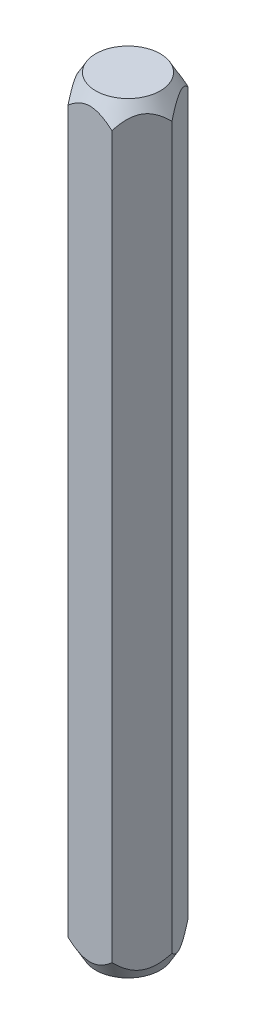
ISO-10303-21;
HEADER;
FILE_DESCRIPTION(('STEP AP214'),'2;1');
FILE_NAME('part.step','',(''),(''),'','','');
FILE_SCHEMA(('AUTOMOTIVE_DESIGN { 1 0 10303 214 1 1 1 1 }'));
ENDSEC;
DATA;
#1=APPLICATION_CONTEXT('core data for automotive mechanical design processes');
#2=APPLICATION_PROTOCOL_DEFINITION('international standard','automotive_design',2000,#1);
#3=PRODUCT_CONTEXT('',#1,'mechanical');
#4=PRODUCT('Part','Part','',(#3));
#5=PRODUCT_RELATED_PRODUCT_CATEGORY('part','',(#4));
#6=PRODUCT_DEFINITION_FORMATION('','',#4);
#7=PRODUCT_DEFINITION_CONTEXT('part definition',#1,'design');
#8=PRODUCT_DEFINITION('design','',#6,#7);
#9=PRODUCT_DEFINITION_SHAPE('','',#8);
#10=(LENGTH_UNIT() NAMED_UNIT(*) SI_UNIT(.MILLI.,.METRE.));
#11=(NAMED_UNIT(*) PLANE_ANGLE_UNIT() SI_UNIT($,.RADIAN.));
#12=(NAMED_UNIT(*) SI_UNIT($,.STERADIAN.) SOLID_ANGLE_UNIT());
#13=UNCERTAINTY_MEASURE_WITH_UNIT(LENGTH_MEASURE(1.E-05),#10,'distance_accuracy_value','');
#14=(GEOMETRIC_REPRESENTATION_CONTEXT(3) GLOBAL_UNCERTAINTY_ASSIGNED_CONTEXT((#13)) GLOBAL_UNIT_ASSIGNED_CONTEXT((#10,
#11,#12)) REPRESENTATION_CONTEXT('',''));
#15=CARTESIAN_POINT('',(0.,0.,0.));
#16=DIRECTION('',(0.,0.,1.));
#17=DIRECTION('',(1.,0.,0.));
#18=AXIS2_PLACEMENT_3D('',#15,#16,#17);
#19=CARTESIAN_POINT('',(0.,-13.,0.));
#20=DIRECTION('',(0.,1.,0.));
#21=DIRECTION('',(0.,0.,1.));
#22=AXIS2_PLACEMENT_3D('',#19,#20,#21);
#23=PLANE('',#22);
#24=CARTESIAN_POINT('',(0.,-13.,0.));
#25=DIRECTION('',(0.,-1.,0.));
#26=DIRECTION('',(0.,0.,-1.));
#27=AXIS2_PLACEMENT_3D('',#24,#25,#26);
#28=CIRCLE('',#27,1.1);
#29=CARTESIAN_POINT('',(0.,-13.,-1.1));
#30=VERTEX_POINT('',#29);
#31=EDGE_CURVE('E235',#30,#30,#28,.T.);
#32=ORIENTED_EDGE('',*,*,#31,.T.);
#33=EDGE_LOOP('',(#32));
#34=FACE_BOUND('',#33,.T.);
#35=ADVANCED_FACE('F41',(#34),#23,.F.);
#36=CARTESIAN_POINT('',(0.,-12.3,0.));
#37=DIRECTION('',(0.,1.,0.));
#38=DIRECTION('',(0.,0.,1.));
#39=AXIS2_PLACEMENT_3D('',#36,#37,#38);
#40=CONICAL_SURFACE('',#39,1.5,0.519146114246519);
#41=ORIENTED_EDGE('',*,*,#31,.F.);
#42=EDGE_LOOP('',(#41));
#43=FACE_BOUND('',#42,.T.);
#44=CARTESIAN_POINT('',(-2.07253485495861,-10.6445054642753,1.29903810567668));
#45=CARTESIAN_POINT('',(-2.03538623793564,-10.6995854387625,1.29903810567668));
#46=CARTESIAN_POINT('',(-1.99804778135316,-10.7545379106194,1.29903810567668));
#47=CARTESIAN_POINT('',(-1.92291943767532,-10.8641377250613,1.29903810567668));
#48=CARTESIAN_POINT('',(-1.88512952568828,-10.9187850505755,1.29903810567668));
#49=CARTESIAN_POINT('',(-1.77082429318832,-11.0824095365471,1.29903810567668));
#50=CARTESIAN_POINT('',(-1.69352606536808,-11.190841663383,1.29903810567667));
#51=CARTESIAN_POINT('',(-1.53196552591616,-11.4111605751849,1.29903810567667));
#52=CARTESIAN_POINT('',(-1.44754976557089,-11.5229362538769,1.29903810567667));
#53=CARTESIAN_POINT('',(-1.31736248949664,-11.687707759074,1.29903810567667));
#54=CARTESIAN_POINT('',(-1.2733938559672,-11.7421251999243,1.29903810567667));
#55=CARTESIAN_POINT('',(-1.18394248532172,-11.8496971859777,1.29903810567667));
#56=CARTESIAN_POINT('',(-1.13845992720302,-11.9028518792159,1.29903810567667));
#57=CARTESIAN_POINT('',(-1.04606630373218,-12.0068956974134,1.29903810567667));
#58=CARTESIAN_POINT('',(-0.99917589751005,-12.0578030562562,1.29903810567667));
#59=CARTESIAN_POINT('',(-0.902905518082981,-12.1573290918742,1.29903810567667));
#60=CARTESIAN_POINT('',(-0.853523188312257,-12.2059455148546,1.29903810567667));
#61=CARTESIAN_POINT('',(-0.752132260774152,-12.2992068812944,1.29903810567666));
#62=CARTESIAN_POINT('',(-0.700159699118788,-12.3438905358105,1.29903810567666));
#63=CARTESIAN_POINT('',(-0.592198590812927,-12.42803583742,1.29903810567666));
#64=CARTESIAN_POINT('',(-0.536218911719411,-12.4675084969099,1.29903810567666));
#65=CARTESIAN_POINT('',(-0.433498084070132,-12.5295405301596,1.29903810567666));
#66=CARTESIAN_POINT('',(-0.387849628266947,-12.5538748512374,1.29903810567666));
#67=CARTESIAN_POINT('',(-0.293526604004841,-12.5957302033474,1.29903810567666));
#68=CARTESIAN_POINT('',(-0.24485895800278,-12.613266197404,1.29903810567666));
#69=CARTESIAN_POINT('',(-0.15319315040133,-12.6370694717298,1.29903810567666));
#70=CARTESIAN_POINT('',(-0.110559843935735,-12.6447054155175,1.29903810567666));
#71=CARTESIAN_POINT('',(-0.0245950358367171,-12.6525133256309,1.29903810567666));
#72=CARTESIAN_POINT('',(0.0187362836021593,-12.6526872090989,1.29903810567666));
#73=CARTESIAN_POINT('',(0.1046758971115,-12.6455528412022,1.29903810567666));
#74=CARTESIAN_POINT('',(0.147285340581523,-12.6382579036111,1.29903810567666));
#75=CARTESIAN_POINT('',(0.230844394471177,-12.6172064684648,1.29903810567665));
#76=CARTESIAN_POINT('',(0.271792683893705,-12.6034449338227,1.29903810567665));
#77=CARTESIAN_POINT('',(0.379155683060805,-12.5596243102184,1.29903810567665));
#78=CARTESIAN_POINT('',(0.443632811839523,-12.524872986136,1.29903810567665));
#79=CARTESIAN_POINT('',(0.536093495284723,-12.4662230265959,1.29903810567665));
#80=CARTESIAN_POINT('',(0.566280834868057,-12.4455205799594,1.29903810567665));
#81=CARTESIAN_POINT('',(0.625395796048653,-12.4023888180353,1.29903810567665));
#82=CARTESIAN_POINT('',(0.65432387889121,-12.3799601435129,1.29903810567665));
#83=CARTESIAN_POINT('',(0.731646260557354,-12.3170177665695,1.29903810567665));
#84=CARTESIAN_POINT('',(0.778952826746299,-12.2751785470326,1.29903810567665));
#85=CARTESIAN_POINT('',(0.871034974400611,-12.1887832099594,1.29903810567665));
#86=CARTESIAN_POINT('',(0.915808803866981,-12.1442252549995,1.29903810567665));
#87=CARTESIAN_POINT('',(1.00345191718129,-12.0530954920219,1.29903810567665));
#88=CARTESIAN_POINT('',(1.0463167473225,-12.0065194285746,1.29903810567665));
#89=CARTESIAN_POINT('',(1.13045799987153,-11.9119490096584,1.29903810567665));
#90=CARTESIAN_POINT('',(1.17173414809036,-11.8639544118706,1.29903810567664));
#91=CARTESIAN_POINT('',(1.29402411346602,-11.7179577797709,1.29903810567664));
#92=CARTESIAN_POINT('',(1.37311876688961,-11.6183520364851,1.29903810567664));
#93=CARTESIAN_POINT('',(1.5277949862243,-11.4166840738683,1.29903810567664));
#94=CARTESIAN_POINT('',(1.6033807977517,-11.3146250626919,1.29903810567664));
#95=CARTESIAN_POINT('',(1.74551356738803,-11.1179594614914,1.29903810567664));
#96=CARTESIAN_POINT('',(1.81226533710321,-11.0235002712326,1.29903810567664));
#97=CARTESIAN_POINT('',(1.94369038410244,-10.8343046189558,1.29903810567664));
#98=CARTESIAN_POINT('',(2.00837631113089,-10.739576959479,1.29903810567664));
#99=CARTESIAN_POINT('',(2.07253485495865,-10.6445054642753,1.29903810567664));
#100=B_SPLINE_CURVE_WITH_KNOTS('',3,(#44,#45,#46,#47,#48,#49,#50,#51,#52,#53,#54,#55,#56,#57,
#58,#59,#60,#61,#62,#63,#64,#65,#66,#67,#68,#69,#70,#71,#72,#73,#74,#75,#76,#77,#78,#79,#80,#81,
#82,#83,#84,#85,#86,#87,#88,#89,#90,#91,#92,#93,#94,#95,#96,#97,#98,#99),.UNSPECIFIED.,.F.,.F.,
(4,2,2,2,2,2,2,2,2,2,2,2,2,2,2,2,2,2,2,2,2,2,2,2,2,2,2,4),(0.,0.199309941791665,
0.398630924034156,0.798094667911543,1.21820476163974,1.42806663426301,1.63790378160688,
1.84548111764697,2.05325857539453,2.25868516950042,2.46367043823923,2.6184799554092,
2.77294677782483,2.90229727841162,3.03161454624821,3.16070169633707,3.28988956459299,
3.5082750015484,3.61806680102762,3.7278180412222,3.91711654272995,4.10654442762103,
4.29639328838321,4.48627476936934,4.86771182519658,5.24867463357979,5.59565170158734,
5.93975000862927),.UNSPECIFIED.);
#101=CARTESIAN_POINT('',(-0.749999999999982,-12.3,1.29903810567666));
#102=VERTEX_POINT('',#101);
#103=CARTESIAN_POINT('',(0.750000000000015,-12.3,1.29903810567665));
#104=VERTEX_POINT('',#103);
#105=EDGE_CURVE('E226',#102,#104,#100,.T.);
#106=ORIENTED_EDGE('',*,*,#105,.F.);
#107=CARTESIAN_POINT('',(-1.50011427265704,-12.2998,-0.000197926047896112));
#108=CARTESIAN_POINT('',(-1.4844560329754,-12.3271747579679,0.0269229406377911));
#109=CARTESIAN_POINT('',(-1.46848195449817,-12.3538800893295,0.0545908561644544));
#110=CARTESIAN_POINT('',(-1.43569548405083,-12.4055169111973,0.111378688780088));
#111=CARTESIAN_POINT('',(-1.41887901814407,-12.4304380044114,0.140505662134349));
#112=CARTESIAN_POINT('',(-1.38391500160076,-12.4783836425917,0.201065115224034));
#113=CARTESIAN_POINT('',(-1.36574408969251,-12.5013411744891,0.232538057868983));
#114=CARTESIAN_POINT('',(-1.32841093508815,-12.5436117266531,0.297200978450572));
#115=CARTESIAN_POINT('',(-1.30925105807725,-12.5629329732754,0.330386858900213));
#116=CARTESIAN_POINT('',(-1.26838798330661,-12.5980525589006,0.401163780556447));
#117=CARTESIAN_POINT('',(-1.24660186054834,-12.6134770395848,0.438898452073694));
#118=CARTESIAN_POINT('',(-1.20221357157386,-12.6369483088712,0.515781223838552));
#119=CARTESIAN_POINT('',(-1.17961959829794,-12.6450547788082,0.554915133497294));
#120=CARTESIAN_POINT('',(-1.13384224962675,-12.6528895799723,0.634203827231584));
#121=CARTESIAN_POINT('',(-1.11065535633217,-12.6525397632328,0.674364704487475));
#122=CARTESIAN_POINT('',(-1.06467286203397,-12.6433215388631,0.75400872087071));
#123=CARTESIAN_POINT('',(-1.04187839232794,-12.6344317002164,0.793489900533146));
#124=CARTESIAN_POINT('',(-0.991146983129713,-12.6060006684914,0.881359278804033));
#125=CARTESIAN_POINT('',(-0.963537845666472,-12.5841886627298,0.929179707643519));
#126=CARTESIAN_POINT('',(-0.910253599849042,-12.5323504473517,1.0214707286423));
#127=CARTESIAN_POINT('',(-0.884588776237873,-12.5022839857869,1.06592350710413));
#128=CARTESIAN_POINT('',(-0.8403915127757,-12.443815750008,1.14247541297612));
#129=CARTESIAN_POINT('',(-0.82150955139978,-12.4164389030966,1.17517992942577));
#130=CARTESIAN_POINT('',(-0.784926482622611,-12.3595575952382,1.23854366324461));
#131=CARTESIAN_POINT('',(-0.767213792789508,-12.3300831132095,1.26922294197425));
#132=CARTESIAN_POINT('',(-0.749885727342731,-12.2997999999996,1.29923603172495));
#133=B_SPLINE_CURVE_WITH_KNOTS('',3,(#107,#108,#109,#110,#111,#112,#113,#114,#115,#116,#117,
#118,#119,#120,#121,#122,#123,#124,#125,#126,#127,#128,#129,#130,#131,#132),.UNSPECIFIED.,.F.,
.F.,(4,2,2,2,2,2,2,2,2,2,2,2,4),(0.,0.124825594013034,0.250327656131258,0.379126359053955,
0.50763008326451,0.645790755097726,0.7828142157728,0.921104445712331,1.05974262128001,
1.2368440400738,1.41482490290691,1.55465046692619,1.69277279754431),.UNSPECIFIED.);
#134=CARTESIAN_POINT('',(-1.5,-12.3,0.));
#135=VERTEX_POINT('',#134);
#136=EDGE_CURVE('E229',#135,#102,#133,.T.);
#137=ORIENTED_EDGE('',*,*,#136,.F.);
#138=CARTESIAN_POINT('',(-0.74988572734275,-12.2997999999996,-1.29923603172494));
#139=CARTESIAN_POINT('',(-0.765543967024386,-12.3271747579676,-1.27211516503925));
#140=CARTESIAN_POINT('',(-0.781518045501619,-12.3538800893291,-1.24444724951259));
#141=CARTESIAN_POINT('',(-0.814304515948947,-12.405516911197,-1.18765941689696));
#142=CARTESIAN_POINT('',(-0.831120981855707,-12.4304380044111,-1.15853244354271));
#143=CARTESIAN_POINT('',(-0.86608499839901,-12.4783836425914,-1.09797299045303));
#144=CARTESIAN_POINT('',(-0.884255910307259,-12.5013411744888,-1.06650004780808));
#145=CARTESIAN_POINT('',(-0.921589064911623,-12.5436117266528,-1.0018371272265));
#146=CARTESIAN_POINT('',(-0.940748941922516,-12.5629329732752,-0.968651246776858));
#147=CARTESIAN_POINT('',(-0.981612016693154,-12.5980525589004,-0.897874325120626));
#148=CARTESIAN_POINT('',(-1.00339813945142,-12.6134770395847,-0.860139653603378));
#149=CARTESIAN_POINT('',(-1.04778642842591,-12.6369483088711,-0.783256881838514));
#150=CARTESIAN_POINT('',(-1.07038040170183,-12.6450547788082,-0.744122972179767));
#151=CARTESIAN_POINT('',(-1.11615775037302,-12.6528895799723,-0.664834278445462));
#152=CARTESIAN_POINT('',(-1.13934464366761,-12.6525397632328,-0.62467340118956));
#153=CARTESIAN_POINT('',(-1.18532713796582,-12.6433215388632,-0.5450293848063));
#154=CARTESIAN_POINT('',(-1.20812160767186,-12.6344317002165,-0.505548205143849));
#155=CARTESIAN_POINT('',(-1.25885301687008,-12.6060006684915,-0.417678826872975));
#156=CARTESIAN_POINT('',(-1.2864621543333,-12.58418866273,-0.369858398033513));
#157=CARTESIAN_POINT('',(-1.33974640015071,-12.5323504473519,-0.277567377034778));
#158=CARTESIAN_POINT('',(-1.36541122376187,-12.5022839857872,-0.233114598572959));
#159=CARTESIAN_POINT('',(-1.40960848722404,-12.4438157500083,-0.156562692700972));
#160=CARTESIAN_POINT('',(-1.42849044859996,-12.4164389030969,-0.123858176251312));
#161=CARTESIAN_POINT('',(-1.46507351737715,-12.3595575952385,-0.0604944424324425));
#162=CARTESIAN_POINT('',(-1.48278620721026,-12.3300831132099,-0.0298151637027901));
#163=CARTESIAN_POINT('',(-1.50011427265704,-12.2998,0.000197926047917414));
#164=B_SPLINE_CURVE_WITH_KNOTS('',3,(#138,#139,#140,#141,#142,#143,#144,#145,#146,#147,#148,
#149,#150,#151,#152,#153,#154,#155,#156,#157,#158,#159,#160,#161,#162,#163),.UNSPECIFIED.,.F.,
.F.,(4,2,2,2,2,2,2,2,2,2,2,2,4),(0.,0.124825594013047,0.250327656131286,0.379126359054001,
0.507630083264572,0.645790755097818,0.782814215772923,0.921104445712489,1.05974262128021,
1.23684404007387,1.41482490290686,1.55465046692617,1.69277279754431),.UNSPECIFIED.);
#165=CARTESIAN_POINT('',(-0.750000000000009,-12.3,-1.29903810567665));
#166=VERTEX_POINT('',#165);
#167=EDGE_CURVE('E99',#166,#135,#164,.T.);
#168=ORIENTED_EDGE('',*,*,#167,.F.);
#169=CARTESIAN_POINT('',(2.07253485495862,-10.6445054642753,-1.29903810567666));
#170=CARTESIAN_POINT('',(2.03538623793565,-10.6995854387625,-1.29903810567666));
#171=CARTESIAN_POINT('',(1.99804778135317,-10.7545379106194,-1.29903810567666));
#172=CARTESIAN_POINT('',(1.92291943767533,-10.8641377250613,-1.29903810567666));
#173=CARTESIAN_POINT('',(1.88512952568829,-10.9187850505755,-1.29903810567666));
#174=CARTESIAN_POINT('',(1.77082429318833,-11.0824095365471,-1.29903810567666));
#175=CARTESIAN_POINT('',(1.69352606536809,-11.190841663383,-1.29903810567666));
#176=CARTESIAN_POINT('',(1.53196552591617,-11.4111605751849,-1.29903810567666));
#177=CARTESIAN_POINT('',(1.4475497655709,-11.5229362538769,-1.29903810567666));
#178=CARTESIAN_POINT('',(1.31736248949665,-11.687707759074,-1.29903810567666));
#179=CARTESIAN_POINT('',(1.27339385596721,-11.7421251999243,-1.29903810567666));
#180=CARTESIAN_POINT('',(1.18394248532173,-11.8496971859777,-1.29903810567666));
#181=CARTESIAN_POINT('',(1.13845992720303,-11.9028518792159,-1.29903810567666));
#182=CARTESIAN_POINT('',(1.04606630373219,-12.0068956974133,-1.29903810567666));
#183=CARTESIAN_POINT('',(0.99917589751006,-12.0578030562562,-1.29903810567666));
#184=CARTESIAN_POINT('',(0.902905518082992,-12.1573290918742,-1.29903810567666));
#185=CARTESIAN_POINT('',(0.853523188312268,-12.2059455148546,-1.29903810567666));
#186=CARTESIAN_POINT('',(0.752132260774163,-12.2992068812944,-1.29903810567666));
#187=CARTESIAN_POINT('',(0.700159699118799,-12.3438905358105,-1.29903810567666));
#188=CARTESIAN_POINT('',(0.592198590812938,-12.42803583742,-1.29903810567666));
#189=CARTESIAN_POINT('',(0.536218911719422,-12.4675084969099,-1.29903810567666));
#190=CARTESIAN_POINT('',(0.433498084070144,-12.5295405301596,-1.29903810567666));
#191=CARTESIAN_POINT('',(0.387849628266959,-12.5538748512374,-1.29903810567666));
#192=CARTESIAN_POINT('',(0.293526604004853,-12.5957302033474,-1.29903810567666));
#193=CARTESIAN_POINT('',(0.244858958002792,-12.613266197404,-1.29903810567666));
#194=CARTESIAN_POINT('',(0.153193150401342,-12.6370694717298,-1.29903810567666));
#195=CARTESIAN_POINT('',(0.110559843935746,-12.6447054155175,-1.29903810567666));
#196=CARTESIAN_POINT('',(0.0245950358367283,-12.6525133256309,-1.29903810567666));
#197=CARTESIAN_POINT('',(-0.0187362836021482,-12.6526872090989,-1.29903810567666));
#198=CARTESIAN_POINT('',(-0.104675897111488,-12.6455528412022,-1.29903810567666));
#199=CARTESIAN_POINT('',(-0.147285340581511,-12.6382579036111,-1.29903810567666));
#200=CARTESIAN_POINT('',(-0.230844394471166,-12.6172064684648,-1.29903810567666));
#201=CARTESIAN_POINT('',(-0.271792683893694,-12.6034449338227,-1.29903810567666));
#202=CARTESIAN_POINT('',(-0.379155683060794,-12.5596243102184,-1.29903810567666));
#203=CARTESIAN_POINT('',(-0.44363281183951,-12.524872986136,-1.29903810567666));
#204=CARTESIAN_POINT('',(-0.536093495284711,-12.4662230265959,-1.29903810567666));
#205=CARTESIAN_POINT('',(-0.566280834868045,-12.4455205799594,-1.29903810567666));
#206=CARTESIAN_POINT('',(-0.62539579604864,-12.4023888180353,-1.29903810567665));
#207=CARTESIAN_POINT('',(-0.654323878891197,-12.3799601435129,-1.29903810567665));
#208=CARTESIAN_POINT('',(-0.731646260557339,-12.3170177665695,-1.29903810567665));
#209=CARTESIAN_POINT('',(-0.778952826746284,-12.2751785470326,-1.29903810567665));
#210=CARTESIAN_POINT('',(-0.871034974400595,-12.1887832099594,-1.29903810567665));
#211=CARTESIAN_POINT('',(-0.915808803866964,-12.1442252549995,-1.29903810567665));
#212=CARTESIAN_POINT('',(-1.00345191718127,-12.0530954920219,-1.29903810567665));
#213=CARTESIAN_POINT('',(-1.04631674732248,-12.0065194285746,-1.29903810567665));
#214=CARTESIAN_POINT('',(-1.13045799987152,-11.9119490096584,-1.29903810567665));
#215=CARTESIAN_POINT('',(-1.17173414809034,-11.8639544118707,-1.29903810567665));
#216=CARTESIAN_POINT('',(-1.294024113466,-11.7179577797709,-1.29903810567665));
#217=CARTESIAN_POINT('',(-1.37311876688959,-11.6183520364851,-1.29903810567665));
#218=CARTESIAN_POINT('',(-1.52779498622428,-11.4166840738683,-1.29903810567665));
#219=CARTESIAN_POINT('',(-1.60338079775168,-11.3146250626919,-1.29903810567665));
#220=CARTESIAN_POINT('',(-1.745513567388,-11.1179594614914,-1.29903810567665));
#221=CARTESIAN_POINT('',(-1.81226533710318,-11.0235002712326,-1.29903810567665));
#222=CARTESIAN_POINT('',(-1.94369038410242,-10.8343046189558,-1.29903810567665));
#223=CARTESIAN_POINT('',(-2.00837631113086,-10.7395769594791,-1.29903810567665));
#224=CARTESIAN_POINT('',(-2.07253485495863,-10.6445054642753,-1.29903810567665));
#225=B_SPLINE_CURVE_WITH_KNOTS('',3,(#169,#170,#171,#172,#173,#174,#175,#176,#177,#178,#179,
#180,#181,#182,#183,#184,#185,#186,#187,#188,#189,#190,#191,#192,#193,#194,#195,#196,#197,#198,
#199,#200,#201,#202,#203,#204,#205,#206,#207,#208,#209,#210,#211,#212,#213,#214,#215,#216,#217,
#218,#219,#220,#221,#222,#223,#224),.UNSPECIFIED.,.F.,.F.,(4,2,2,2,2,2,2,2,2,2,2,2,2,2,2,2,2,2,
2,2,2,2,2,2,2,2,2,4),(0.,0.199309941791665,0.398630924034156,0.798094667911541,1.21820476163973,
1.42806663426301,1.63790378160687,1.84548111764697,2.05325857539452,2.25868516950042,
2.46367043823923,2.61847995540919,2.77294677782483,2.90229727841162,3.03161454624821,
3.16070169633707,3.28988956459298,3.5082750015484,3.61806680102762,3.72781804122219,
3.91711654272994,4.10654442762102,4.29639328838319,4.48627476936932,4.86771182519656,
5.24867463357977,5.59565170158731,5.93975000862924),.UNSPECIFIED.);
#226=CARTESIAN_POINT('',(0.749999999999991,-12.3,-1.29903810567666));
#227=VERTEX_POINT('',#226);
#228=EDGE_CURVE('E94',#227,#166,#225,.T.);
#229=ORIENTED_EDGE('',*,*,#228,.F.);
#230=CARTESIAN_POINT('',(1.50011427265704,-12.2998,0.00019792604790659));
#231=CARTESIAN_POINT('',(1.4844560329754,-12.3271747579679,-0.0269229406377801));
#232=CARTESIAN_POINT('',(1.46848195449817,-12.3538800893295,-0.0545908561644435));
#233=CARTESIAN_POINT('',(1.43569548405083,-12.4055169111973,-0.111378688780077));
#234=CARTESIAN_POINT('',(1.41887901814407,-12.4304380044114,-0.140505662134339));
#235=CARTESIAN_POINT('',(1.38391500160077,-12.4783836425917,-0.201065115224024));
#236=CARTESIAN_POINT('',(1.36574408969252,-12.5013411744891,-0.232538057868973));
#237=CARTESIAN_POINT('',(1.32841093508815,-12.5436117266531,-0.297200978450562));
#238=CARTESIAN_POINT('',(1.30925105807725,-12.5629329732754,-0.330386858900203));
#239=CARTESIAN_POINT('',(1.26838798330661,-12.5980525589006,-0.401163780556437));
#240=CARTESIAN_POINT('',(1.24660186054835,-12.6134770395848,-0.438898452073684));
#241=CARTESIAN_POINT('',(1.20221357157386,-12.6369483088712,-0.515781223838542));
#242=CARTESIAN_POINT('',(1.17961959829794,-12.6450547788082,-0.554915133497285));
#243=CARTESIAN_POINT('',(1.13384224962676,-12.6528895799723,-0.634203827231574));
#244=CARTESIAN_POINT('',(1.11065535633218,-12.6525397632328,-0.674364704487466));
#245=CARTESIAN_POINT('',(1.06467286203397,-12.6433215388631,-0.754008720870701));
#246=CARTESIAN_POINT('',(1.04187839232794,-12.6344317002164,-0.793489900533138));
#247=CARTESIAN_POINT('',(0.99114698312972,-12.6060006684914,-0.881359278804025));
#248=CARTESIAN_POINT('',(0.963537845666479,-12.5841886627298,-0.929179707643511));
#249=CARTESIAN_POINT('',(0.91025359984905,-12.5323504473517,-1.02147072864229));
#250=CARTESIAN_POINT('',(0.884588776237881,-12.5022839857869,-1.06592350710413));
#251=CARTESIAN_POINT('',(0.840391512775709,-12.443815750008,-1.14247541297612));
#252=CARTESIAN_POINT('',(0.821509551399789,-12.4164389030966,-1.17517992942576));
#253=CARTESIAN_POINT('',(0.78492648262262,-12.3595575952382,-1.23854366324461));
#254=CARTESIAN_POINT('',(0.767213792789518,-12.3300831132095,-1.26922294197425));
#255=CARTESIAN_POINT('',(0.74988572734274,-12.2997999999996,-1.29923603172494));
#256=B_SPLINE_CURVE_WITH_KNOTS('',3,(#230,#231,#232,#233,#234,#235,#236,#237,#238,#239,#240,
#241,#242,#243,#244,#245,#246,#247,#248,#249,#250,#251,#252,#253,#254,#255),.UNSPECIFIED.,.F.,
.F.,(4,2,2,2,2,2,2,2,2,2,2,2,4),(0.,0.124825594013033,0.250327656131256,0.379126359053955,
0.507630083264509,0.645790755097723,0.782814215772798,0.921104445712329,1.05974262128001,
1.2368440400738,1.41482490290691,1.55465046692619,1.69277279754431),.UNSPECIFIED.);
#257=CARTESIAN_POINT('',(1.5,-12.3,0.));
#258=VERTEX_POINT('',#257);
#259=EDGE_CURVE('E97',#258,#227,#256,.T.);
#260=ORIENTED_EDGE('',*,*,#259,.F.);
#261=CARTESIAN_POINT('',(0.749885727342759,-12.2997999999996,1.29923603172493));
#262=CARTESIAN_POINT('',(0.765543967024395,-12.3271747579676,1.27211516503925));
#263=CARTESIAN_POINT('',(0.781518045501628,-12.3538800893291,1.24444724951259));
#264=CARTESIAN_POINT('',(0.814304515948957,-12.405516911197,1.18765941689696));
#265=CARTESIAN_POINT('',(0.831120981855717,-12.4304380044111,1.1585324435427));
#266=CARTESIAN_POINT('',(0.86608499839902,-12.4783836425914,1.09797299045302));
#267=CARTESIAN_POINT('',(0.884255910307269,-12.5013411744888,1.06650004780807));
#268=CARTESIAN_POINT('',(0.921589064911633,-12.5436117266528,1.00183712722649));
#269=CARTESIAN_POINT('',(0.940748941922527,-12.5629329732752,0.96865124677685));
#270=CARTESIAN_POINT('',(0.981612016693165,-12.5980525589004,0.897874325120618));
#271=CARTESIAN_POINT('',(1.00339813945143,-12.6134770395847,0.86013965360337));
#272=CARTESIAN_POINT('',(1.04778642842592,-12.6369483088711,0.783256881838506));
#273=CARTESIAN_POINT('',(1.07038040170184,-12.6450547788081,0.744122972179758));
#274=CARTESIAN_POINT('',(1.11615775037303,-12.6528895799723,0.664834278445453));
#275=CARTESIAN_POINT('',(1.13934464366762,-12.6525397632328,0.624673401189551));
#276=CARTESIAN_POINT('',(1.18532713796584,-12.6433215388632,0.545029384806291));
#277=CARTESIAN_POINT('',(1.20812160767188,-12.6344317002165,0.505548205143841));
#278=CARTESIAN_POINT('',(1.25885301687009,-12.6060006684915,0.417678826872966));
#279=CARTESIAN_POINT('',(1.28646215433332,-12.58418866273,0.369858398033503));
#280=CARTESIAN_POINT('',(1.33974640015072,-12.5323504473519,0.277567377034766));
#281=CARTESIAN_POINT('',(1.36541122376188,-12.5022839857872,0.233114598572947));
#282=CARTESIAN_POINT('',(1.40960848722405,-12.4438157500083,0.156562692700963));
#283=CARTESIAN_POINT('',(1.42849044859997,-12.4164389030969,0.123858176251307));
#284=CARTESIAN_POINT('',(1.46507351737715,-12.3595575952385,0.0604944424324461));
#285=CARTESIAN_POINT('',(1.48278620721026,-12.3300831132099,0.0298151637027971));
#286=CARTESIAN_POINT('',(1.50011427265704,-12.2998,-0.000197926047906983));
#287=B_SPLINE_CURVE_WITH_KNOTS('',3,(#261,#262,#263,#264,#265,#266,#267,#268,#269,#270,#271,
#272,#273,#274,#275,#276,#277,#278,#279,#280,#281,#282,#283,#284,#285,#286),.UNSPECIFIED.,.F.,
.F.,(4,2,2,2,2,2,2,2,2,2,2,2,4),(0.,0.124825594013048,0.250327656131286,0.379126359054001,
0.507630083264573,0.645790755097819,0.782814215772924,0.92110444571249,1.05974262128021,
1.23684404007388,1.41482490290687,1.55465046692616,1.69277279754429),.UNSPECIFIED.);
#288=EDGE_CURVE('E66',#104,#258,#287,.T.);
#289=ORIENTED_EDGE('',*,*,#288,.F.);
#290=EDGE_LOOP('',(#106,#137,#168,#229,#260,#289));
#291=FACE_BOUND('',#290,.T.);
#292=ADVANCED_FACE('F96',(#43,#291),#40,.T.);
#293=CARTESIAN_POINT('',(0.750000000000015,13.,1.29903810567665));
#294=DIRECTION('',(-0.866025403784442,0.,-0.499999999999995));
#295=DIRECTION('',(-0.499999999999995,0.,0.866025403784442));
#296=AXIS2_PLACEMENT_3D('',#293,#294,#295);
#297=PLANE('',#296);
#298=DIRECTION('',(0.,-1.,0.));
#299=VECTOR('',#298,1.);
#300=CARTESIAN_POINT('',(1.5,13.,0.));
#301=LINE('',#300,#299);
#302=CARTESIAN_POINT('',(1.5,12.3,0.));
#303=VERTEX_POINT('',#302);
#304=EDGE_CURVE('E11',#303,#258,#301,.T.);
#305=ORIENTED_EDGE('',*,*,#304,.F.);
#306=CARTESIAN_POINT('',(1.50011427265704,12.2998,-0.000197926047911828));
#307=CARTESIAN_POINT('',(1.4844560329754,12.327174757968,0.0269229406377757));
#308=CARTESIAN_POINT('',(1.46848195449817,12.3538800893295,0.0545908561644392));
#309=CARTESIAN_POINT('',(1.43569548405084,12.4055169111973,0.111378688780073));
#310=CARTESIAN_POINT('',(1.41887901814408,12.4304380044114,0.140505662134334));
#311=CARTESIAN_POINT('',(1.38391500160077,12.4783836425917,0.20106511522402));
#312=CARTESIAN_POINT('',(1.36574408969252,12.5013411744891,0.232538057868969));
#313=CARTESIAN_POINT('',(1.32841093508815,12.543611726653,0.297200978450559));
#314=CARTESIAN_POINT('',(1.30925105807726,12.5629329732754,0.330386858900201));
#315=CARTESIAN_POINT('',(1.26838798330662,12.5980525589006,0.401163780556436));
#316=CARTESIAN_POINT('',(1.24660186054835,12.6134770395848,0.438898452073684));
#317=CARTESIAN_POINT('',(1.20221357157387,12.6369483088712,0.515781223838544));
#318=CARTESIAN_POINT('',(1.17961959829795,12.6450547788082,0.554915133497287));
#319=CARTESIAN_POINT('',(1.13384224962676,12.6528895799723,0.634203827231578));
#320=CARTESIAN_POINT('',(1.11065535633218,12.6525397632328,0.67436470448747));
#321=CARTESIAN_POINT('',(1.06467286203398,12.6433215388631,0.754008720870706));
#322=CARTESIAN_POINT('',(1.04187839232795,12.6344317002164,0.793489900533143));
#323=CARTESIAN_POINT('',(0.991146983129724,12.6060006684914,0.881359278804032));
#324=CARTESIAN_POINT('',(0.963537845666483,12.5841886627298,0.92917970764352));
#325=CARTESIAN_POINT('',(0.910253599849052,12.5323504473517,1.0214707286423));
#326=CARTESIAN_POINT('',(0.884588776237883,12.5022839857869,1.06592350710414));
#327=CARTESIAN_POINT('',(0.840391512775713,12.443815750008,1.14247541297613));
#328=CARTESIAN_POINT('',(0.821509551399796,12.4164389030966,1.17517992942577));
#329=CARTESIAN_POINT('',(0.784926482622631,12.3595575952382,1.23854366324461));
#330=CARTESIAN_POINT('',(0.767213792789531,12.3300831132095,1.26922294197424));
#331=CARTESIAN_POINT('',(0.749885727342755,12.2997999999996,1.29923603172494));
#332=B_SPLINE_CURVE_WITH_KNOTS('',3,(#306,#307,#308,#309,#310,#311,#312,#313,#314,#315,#316,
#317,#318,#319,#320,#321,#322,#323,#324,#325,#326,#327,#328,#329,#330,#331),.UNSPECIFIED.,.F.,
.F.,(4,2,2,2,2,2,2,2,2,2,2,2,4),(0.,0.124825594013033,0.250327656131255,0.379126359053952,
0.507630083264509,0.645790755097725,0.782814215772801,0.921104445712334,1.05974262128002,
1.23684404007381,1.41482490290692,1.55465046692619,1.6927727975443),.UNSPECIFIED.);
#333=CARTESIAN_POINT('',(0.750000000000015,12.3,1.29903810567665));
#334=VERTEX_POINT('',#333);
#335=EDGE_CURVE('E133',#303,#334,#332,.T.);
#336=ORIENTED_EDGE('',*,*,#335,.T.);
#337=DIRECTION('',(0.,-1.,0.));
#338=VECTOR('',#337,1.);
#339=CARTESIAN_POINT('',(0.750000000000015,13.,1.29903810567665));
#340=LINE('',#339,#338);
#341=EDGE_CURVE('E129',#334,#104,#340,.T.);
#342=ORIENTED_EDGE('',*,*,#341,.T.);
#343=ORIENTED_EDGE('',*,*,#288,.T.);
#344=EDGE_LOOP('',(#305,#336,#342,#343));
#345=FACE_BOUND('',#344,.T.);
#346=ADVANCED_FACE('F43',(#345),#297,.F.);
#347=CARTESIAN_POINT('',(1.5,13.,0.));
#348=DIRECTION('',(-0.866025403784438,0.,0.500000000000001));
#349=DIRECTION('',(0.500000000000001,0.,0.866025403784438));
#350=AXIS2_PLACEMENT_3D('',#347,#348,#349);
#351=PLANE('',#350);
#352=DIRECTION('',(0.,-1.,0.));
#353=VECTOR('',#352,1.);
#354=CARTESIAN_POINT('',(0.749999999999997,13.,-1.29903810567666));
#355=LINE('',#354,#353);
#356=CARTESIAN_POINT('',(0.749999999999997,12.3,-1.29903810567666));
#357=VERTEX_POINT('',#356);
#358=EDGE_CURVE('E51',#357,#227,#355,.T.);
#359=ORIENTED_EDGE('',*,*,#358,.F.);
#360=CARTESIAN_POINT('',(0.749885727342738,12.2997999999996,-1.29923603172495));
#361=CARTESIAN_POINT('',(0.765543967024374,12.3271747579676,-1.27211516503926));
#362=CARTESIAN_POINT('',(0.781518045501608,12.3538800893291,-1.2444472495126));
#363=CARTESIAN_POINT('',(0.814304515948936,12.405516911197,-1.18765941689697));
#364=CARTESIAN_POINT('',(0.831120981855697,12.4304380044111,-1.15853244354272));
#365=CARTESIAN_POINT('',(0.866084998399,12.4783836425914,-1.09797299045304));
#366=CARTESIAN_POINT('',(0.884255910307249,12.5013411744888,-1.06650004780809));
#367=CARTESIAN_POINT('',(0.921589064911613,12.5436117266528,-1.00183712722651));
#368=CARTESIAN_POINT('',(0.940748941922506,12.5629329732752,-0.96865124677687));
#369=CARTESIAN_POINT('',(0.981612016693145,12.5980525589004,-0.897874325120638));
#370=CARTESIAN_POINT('',(1.00339813945141,12.6134770395847,-0.86013965360339));
#371=CARTESIAN_POINT('',(1.0477864284259,12.6369483088711,-0.783256881838525));
#372=CARTESIAN_POINT('',(1.07038040170182,12.6450547788082,-0.744122972179778));
#373=CARTESIAN_POINT('',(1.11615775037302,12.6528895799723,-0.664834278445472));
#374=CARTESIAN_POINT('',(1.1393446436676,12.6525397632328,-0.62467340118957));
#375=CARTESIAN_POINT('',(1.18532713796582,12.6433215388632,-0.545029384806309));
#376=CARTESIAN_POINT('',(1.20812160767186,12.6344317002165,-0.505548205143858));
#377=CARTESIAN_POINT('',(1.25885301687008,12.6060006684915,-0.417678826872983));
#378=CARTESIAN_POINT('',(1.2864621543333,12.58418866273,-0.369858398033521));
#379=CARTESIAN_POINT('',(1.33974640015071,12.5323504473519,-0.277567377034785));
#380=CARTESIAN_POINT('',(1.36541122376187,12.5022839857872,-0.233114598572966));
#381=CARTESIAN_POINT('',(1.40960848722404,12.4438157500083,-0.156562692700978));
#382=CARTESIAN_POINT('',(1.42849044859997,12.4164389030969,-0.123858176251318));
#383=CARTESIAN_POINT('',(1.46507351737715,12.3595575952385,-0.0604944424324483));
#384=CARTESIAN_POINT('',(1.48278620721026,12.3300831132099,-0.0298151637027955));
#385=CARTESIAN_POINT('',(1.50011427265704,12.2998,0.000197926047912088));
#386=B_SPLINE_CURVE_WITH_KNOTS('',3,(#360,#361,#362,#363,#364,#365,#366,#367,#368,#369,#370,
#371,#372,#373,#374,#375,#376,#377,#378,#379,#380,#381,#382,#383,#384,#385),.UNSPECIFIED.,.F.,
.F.,(4,2,2,2,2,2,2,2,2,2,2,2,4),(0.,0.124825594013048,0.250327656131286,0.379126359054001,
0.507630083264572,0.645790755097819,0.782814215772926,0.921104445712494,1.05974262128021,
1.23684404007388,1.41482490290687,1.55465046692618,1.69277279754432),.UNSPECIFIED.);
#387=EDGE_CURVE('E142',#357,#303,#386,.T.);
#388=ORIENTED_EDGE('',*,*,#387,.T.);
#389=ORIENTED_EDGE('',*,*,#304,.T.);
#390=ORIENTED_EDGE('',*,*,#259,.T.);
#391=EDGE_LOOP('',(#359,#388,#389,#390));
#392=FACE_BOUND('',#391,.T.);
#393=ADVANCED_FACE('F108',(#392),#351,.F.);
#394=CARTESIAN_POINT('',(0.749999999999997,13.,-1.29903810567666));
#395=DIRECTION('',(0.,0.,1.));
#396=DIRECTION('',(1.,0.,0.));
#397=AXIS2_PLACEMENT_3D('',#394,#395,#396);
#398=PLANE('',#397);
#399=DIRECTION('',(0.,-1.,0.));
#400=VECTOR('',#399,1.);
#401=CARTESIAN_POINT('',(-0.750000000000006,13.,-1.29903810567665));
#402=LINE('',#401,#400);
#403=CARTESIAN_POINT('',(-0.750000000000006,12.3,-1.29903810567665));
#404=VERTEX_POINT('',#403);
#405=EDGE_CURVE('E117',#404,#166,#402,.T.);
#406=ORIENTED_EDGE('',*,*,#405,.F.);
#407=CARTESIAN_POINT('',(-2.07253485495864,10.6445054642753,-1.29903810567665));
#408=CARTESIAN_POINT('',(-2.03538623793567,10.6995854387625,-1.29903810567665));
#409=CARTESIAN_POINT('',(-1.99804778135319,10.7545379106194,-1.29903810567665));
#410=CARTESIAN_POINT('',(-1.92291943767536,10.8641377250613,-1.29903810567665));
#411=CARTESIAN_POINT('',(-1.88512952568831,10.9187850505755,-1.29903810567665));
#412=CARTESIAN_POINT('',(-1.77082429318835,11.0824095365471,-1.29903810567665));
#413=CARTESIAN_POINT('',(-1.69352606536811,11.190841663383,-1.29903810567665));
#414=CARTESIAN_POINT('',(-1.53196552591619,11.4111605751849,-1.29903810567665));
#415=CARTESIAN_POINT('',(-1.44754976557092,11.5229362538769,-1.29903810567665));
#416=CARTESIAN_POINT('',(-1.31736248949667,11.687707759074,-1.29903810567665));
#417=CARTESIAN_POINT('',(-1.27339385596723,11.7421251999243,-1.29903810567665));
#418=CARTESIAN_POINT('',(-1.18394248532174,11.8496971859777,-1.29903810567665));
#419=CARTESIAN_POINT('',(-1.13845992720305,11.9028518792159,-1.29903810567665));
#420=CARTESIAN_POINT('',(-1.04606630373221,12.0068956974134,-1.29903810567665));
#421=CARTESIAN_POINT('',(-0.999175897510075,12.0578030562562,-1.29903810567665));
#422=CARTESIAN_POINT('',(-0.902905518083006,12.1573290918742,-1.29903810567665));
#423=CARTESIAN_POINT('',(-0.853523188312282,12.2059455148546,-1.29903810567665));
#424=CARTESIAN_POINT('',(-0.752132260774176,12.2992068812944,-1.29903810567665));
#425=CARTESIAN_POINT('',(-0.700159699118812,12.3438905358105,-1.29903810567665));
#426=CARTESIAN_POINT('',(-0.59219859081295,12.42803583742,-1.29903810567666));
#427=CARTESIAN_POINT('',(-0.536218911719434,12.4675084969099,-1.29903810567666));
#428=CARTESIAN_POINT('',(-0.433498084070155,12.5295405301596,-1.29903810567666));
#429=CARTESIAN_POINT('',(-0.387849628266969,12.5538748512374,-1.29903810567666));
#430=CARTESIAN_POINT('',(-0.293526604004863,12.5957302033474,-1.29903810567666));
#431=CARTESIAN_POINT('',(-0.244858958002801,12.613266197404,-1.29903810567666));
#432=CARTESIAN_POINT('',(-0.153193150401351,12.6370694717298,-1.29903810567666));
#433=CARTESIAN_POINT('',(-0.110559843935755,12.6447054155175,-1.29903810567666));
#434=CARTESIAN_POINT('',(-0.0245950358367356,12.6525133256309,-1.29903810567666));
#435=CARTESIAN_POINT('',(0.0187362836021412,12.6526872090989,-1.29903810567666));
#436=CARTESIAN_POINT('',(0.104675897111483,12.6455528412023,-1.29903810567666));
#437=CARTESIAN_POINT('',(0.147285340581506,12.6382579036111,-1.29903810567666));
#438=CARTESIAN_POINT('',(0.230844394471162,12.6172064684648,-1.29903810567666));
#439=CARTESIAN_POINT('',(0.27179268389369,12.6034449338227,-1.29903810567666));
#440=CARTESIAN_POINT('',(0.379155683060791,12.5596243102184,-1.29903810567666));
#441=CARTESIAN_POINT('',(0.443632811839508,12.524872986136,-1.29903810567666));
#442=CARTESIAN_POINT('',(0.53609349528471,12.4662230265959,-1.29903810567666));
#443=CARTESIAN_POINT('',(0.566280834868045,12.4455205799594,-1.29903810567666));
#444=CARTESIAN_POINT('',(0.625395796048641,12.4023888180353,-1.29903810567666));
#445=CARTESIAN_POINT('',(0.654323878891199,12.3799601435129,-1.29903810567666));
#446=CARTESIAN_POINT('',(0.731646260557343,12.3170177665695,-1.29903810567666));
#447=CARTESIAN_POINT('',(0.778952826746289,12.2751785470326,-1.29903810567666));
#448=CARTESIAN_POINT('',(0.871034974400602,12.1887832099594,-1.29903810567666));
#449=CARTESIAN_POINT('',(0.915808803866973,12.1442252549995,-1.29903810567666));
#450=CARTESIAN_POINT('',(1.00345191718128,12.0530954920219,-1.29903810567666));
#451=CARTESIAN_POINT('',(1.0463167473225,12.0065194285746,-1.29903810567666));
#452=CARTESIAN_POINT('',(1.13045799987153,11.9119490096584,-1.29903810567666));
#453=CARTESIAN_POINT('',(1.17173414809036,11.8639544118706,-1.29903810567666));
#454=CARTESIAN_POINT('',(1.29402411346601,11.7179577797709,-1.29903810567666));
#455=CARTESIAN_POINT('',(1.37311876688961,11.6183520364851,-1.29903810567666));
#456=CARTESIAN_POINT('',(1.5277949862243,11.4166840738682,-1.29903810567666));
#457=CARTESIAN_POINT('',(1.60338079775171,11.3146250626918,-1.29903810567666));
#458=CARTESIAN_POINT('',(1.74551356738803,11.1179594614914,-1.29903810567666));
#459=CARTESIAN_POINT('',(1.8122653371032,11.0235002712326,-1.29903810567666));
#460=CARTESIAN_POINT('',(1.94369038410243,10.8343046189558,-1.29903810567666));
#461=CARTESIAN_POINT('',(2.00837631113087,10.7395769594791,-1.29903810567666));
#462=CARTESIAN_POINT('',(2.07253485495863,10.6445054642753,-1.29903810567666));
#463=B_SPLINE_CURVE_WITH_KNOTS('',3,(#407,#408,#409,#410,#411,#412,#413,#414,#415,#416,#417,
#418,#419,#420,#421,#422,#423,#424,#425,#426,#427,#428,#429,#430,#431,#432,#433,#434,#435,#436,
#437,#438,#439,#440,#441,#442,#443,#444,#445,#446,#447,#448,#449,#450,#451,#452,#453,#454,#455,
#456,#457,#458,#459,#460,#461,#462),.UNSPECIFIED.,.F.,.F.,(4,2,2,2,2,2,2,2,2,2,2,2,2,2,2,2,2,2,
2,2,2,2,2,2,2,2,2,4),(0.,0.199309941791665,0.398630924034157,0.798094667911543,1.21820476163973,
1.42806663426301,1.63790378160688,1.84548111764697,2.05325857539453,2.25868516950043,
2.46367043823924,2.6184799554092,2.77294677782484,2.90229727841163,3.03161454624822,
3.16070169633708,3.289889564593,3.50827500154842,3.61806680102764,3.72781804122221,
3.91711654272997,4.10654442762105,4.29639328838323,4.48627476936937,4.86771182519662,
5.24867463357984,5.59565170158735,5.93975000862926),.UNSPECIFIED.);
#464=EDGE_CURVE('E115',#404,#357,#463,.T.);
#465=ORIENTED_EDGE('',*,*,#464,.T.);
#466=ORIENTED_EDGE('',*,*,#358,.T.);
#467=ORIENTED_EDGE('',*,*,#228,.T.);
#468=EDGE_LOOP('',(#406,#465,#466,#467));
#469=FACE_BOUND('',#468,.T.);
#470=ADVANCED_FACE('F114',(#469),#398,.F.);
#471=CARTESIAN_POINT('',(-0.750000000000006,13.,-1.29903810567665));
#472=DIRECTION('',(0.866025403784442,0.,0.499999999999995));
#473=DIRECTION('',(0.499999999999995,0.,-0.866025403784442));
#474=AXIS2_PLACEMENT_3D('',#471,#472,#473);
#475=PLANE('',#474);
#476=DIRECTION('',(0.,-1.,0.));
#477=VECTOR('',#476,1.);
#478=CARTESIAN_POINT('',(-1.5,13.,0.));
#479=LINE('',#478,#477);
#480=CARTESIAN_POINT('',(-1.5,12.3,0.));
#481=VERTEX_POINT('',#480);
#482=EDGE_CURVE('E119',#481,#135,#479,.T.);
#483=ORIENTED_EDGE('',*,*,#482,.F.);
#484=CARTESIAN_POINT('',(-1.50011427265704,12.2998,0.000197926047922356));
#485=CARTESIAN_POINT('',(-1.4844560329754,12.327174757968,-0.0269229406377645));
#486=CARTESIAN_POINT('',(-1.46848195449817,12.3538800893295,-0.0545908561644278));
#487=CARTESIAN_POINT('',(-1.43569548405084,12.4055169111973,-0.111378688780062));
#488=CARTESIAN_POINT('',(-1.41887901814408,12.4304380044114,-0.140505662134323));
#489=CARTESIAN_POINT('',(-1.38391500160077,12.4783836425917,-0.201065115224009));
#490=CARTESIAN_POINT('',(-1.36574408969252,12.5013411744891,-0.232538057868958));
#491=CARTESIAN_POINT('',(-1.32841093508815,12.5436117266531,-0.297200978450548));
#492=CARTESIAN_POINT('',(-1.30925105807726,12.5629329732754,-0.33038685890019));
#493=CARTESIAN_POINT('',(-1.26838798330662,12.5980525589006,-0.401163780556424));
#494=CARTESIAN_POINT('',(-1.24660186054835,12.6134770395848,-0.438898452073672));
#495=CARTESIAN_POINT('',(-1.20221357157387,12.6369483088712,-0.515781223838531));
#496=CARTESIAN_POINT('',(-1.17961959829795,12.6450547788082,-0.554915133497275));
#497=CARTESIAN_POINT('',(-1.13384224962676,12.6528895799723,-0.634203827231566));
#498=CARTESIAN_POINT('',(-1.11065535633218,12.6525397632328,-0.674364704487458));
#499=CARTESIAN_POINT('',(-1.06467286203398,12.6433215388631,-0.754008720870694));
#500=CARTESIAN_POINT('',(-1.04187839232795,12.6344317002164,-0.793489900533132));
#501=CARTESIAN_POINT('',(-0.991146983129725,12.6060006684914,-0.88135927880402));
#502=CARTESIAN_POINT('',(-0.963537845666484,12.5841886627298,-0.929179707643507));
#503=CARTESIAN_POINT('',(-0.910253599849055,12.5323504473517,-1.02147072864229));
#504=CARTESIAN_POINT('',(-0.884588776237886,12.5022839857869,-1.06592350710412));
#505=CARTESIAN_POINT('',(-0.840391512775714,12.443815750008,-1.14247541297611));
#506=CARTESIAN_POINT('',(-0.821509551399794,12.4164389030966,-1.17517992942576));
#507=CARTESIAN_POINT('',(-0.784926482622625,12.3595575952382,-1.23854366324461));
#508=CARTESIAN_POINT('',(-0.767213792789523,12.3300831132095,-1.26922294197425));
#509=CARTESIAN_POINT('',(-0.749885727342746,12.2997999999996,-1.29923603172494));
#510=B_SPLINE_CURVE_WITH_KNOTS('',3,(#484,#485,#486,#487,#488,#489,#490,#491,#492,#493,#494,
#495,#496,#497,#498,#499,#500,#501,#502,#503,#504,#505,#506,#507,#508,#509),.UNSPECIFIED.,.F.,
.F.,(4,2,2,2,2,2,2,2,2,2,2,2,4),(0.,0.124825594013032,0.250327656131256,0.379126359053955,
0.50763008326451,0.645790755097727,0.782814215772803,0.921104445712336,1.05974262128002,
1.23684404007381,1.41482490290692,1.5546504669262,1.69277279754433),.UNSPECIFIED.);
#511=EDGE_CURVE('E177',#481,#404,#510,.T.);
#512=ORIENTED_EDGE('',*,*,#511,.T.);
#513=ORIENTED_EDGE('',*,*,#405,.T.);
#514=ORIENTED_EDGE('',*,*,#167,.T.);
#515=EDGE_LOOP('',(#483,#512,#513,#514));
#516=FACE_BOUND('',#515,.T.);
#517=ADVANCED_FACE('F191',(#516),#475,.F.);
#518=CARTESIAN_POINT('',(-1.5,13.,0.));
#519=DIRECTION('',(0.866025403784434,0.,-0.500000000000007));
#520=DIRECTION('',(-0.500000000000007,0.,-0.866025403784435));
#521=AXIS2_PLACEMENT_3D('',#518,#519,#520);
#522=PLANE('',#521);
#523=DIRECTION('',(0.,-1.,0.));
#524=VECTOR('',#523,1.);
#525=CARTESIAN_POINT('',(-0.749999999999988,13.,1.29903810567666));
#526=LINE('',#525,#524);
#527=CARTESIAN_POINT('',(-0.749999999999988,12.3,1.29903810567666));
#528=VERTEX_POINT('',#527);
#529=EDGE_CURVE('E125',#528,#102,#526,.T.);
#530=ORIENTED_EDGE('',*,*,#529,.F.);
#531=CARTESIAN_POINT('',(-0.749885727342728,12.2997999999996,1.29923603172495));
#532=CARTESIAN_POINT('',(-0.765543967024365,12.3271747579676,1.27211516503927));
#533=CARTESIAN_POINT('',(-0.781518045501599,12.3538800893291,1.24444724951261));
#534=CARTESIAN_POINT('',(-0.814304515948927,12.405516911197,1.18765941689698));
#535=CARTESIAN_POINT('',(-0.831120981855688,12.4304380044111,1.15853244354272));
#536=CARTESIAN_POINT('',(-0.866084998398991,12.4783836425914,1.09797299045304));
#537=CARTESIAN_POINT('',(-0.884255910307241,12.5013411744888,1.0665000478081));
#538=CARTESIAN_POINT('',(-0.921589064911606,12.5436117266528,1.00183712722651));
#539=CARTESIAN_POINT('',(-0.940748941922499,12.5629329732752,0.968651246776877));
#540=CARTESIAN_POINT('',(-0.981612016693138,12.5980525589004,0.897874325120645));
#541=CARTESIAN_POINT('',(-1.0033981394514,12.6134770395847,0.860139653603397));
#542=CARTESIAN_POINT('',(-1.04778642842589,12.6369483088711,0.783256881838533));
#543=CARTESIAN_POINT('',(-1.07038040170181,12.6450547788082,0.744122972179785));
#544=CARTESIAN_POINT('',(-1.11615775037301,12.6528895799723,0.66483427844548));
#545=CARTESIAN_POINT('',(-1.1393446436676,12.6525397632328,0.624673401189578));
#546=CARTESIAN_POINT('',(-1.18532713796582,12.6433215388632,0.545029384806317));
#547=CARTESIAN_POINT('',(-1.20812160767186,12.6344317002165,0.505548205143866));
#548=CARTESIAN_POINT('',(-1.25885301687007,12.6060006684915,0.417678826872992));
#549=CARTESIAN_POINT('',(-1.2864621543333,12.58418866273,0.36985839803353));
#550=CARTESIAN_POINT('',(-1.33974640015071,12.5323504473519,0.277567377034794));
#551=CARTESIAN_POINT('',(-1.36541122376186,12.5022839857872,0.233114598572976));
#552=CARTESIAN_POINT('',(-1.40960848722404,12.4438157500083,0.156562692700988));
#553=CARTESIAN_POINT('',(-1.42849044859996,12.4164389030969,0.123858176251328));
#554=CARTESIAN_POINT('',(-1.46507351737715,12.3595575952385,0.0604944424324589));
#555=CARTESIAN_POINT('',(-1.48278620721026,12.3300831132099,0.0298151637028064));
#556=CARTESIAN_POINT('',(-1.50011427265704,12.2998,-0.000197926047901627));
#557=B_SPLINE_CURVE_WITH_KNOTS('',3,(#531,#532,#533,#534,#535,#536,#537,#538,#539,#540,#541,
#542,#543,#544,#545,#546,#547,#548,#549,#550,#551,#552,#553,#554,#555,#556),.UNSPECIFIED.,.F.,
.F.,(4,2,2,2,2,2,2,2,2,2,2,2,4),(0.,0.124825594013048,0.250327656131287,0.379126359054001,
0.507630083264572,0.645790755097819,0.782814215772926,0.921104445712494,1.05974262128021,
1.23684404007388,1.41482490290687,1.55465046692618,1.69277279754433),.UNSPECIFIED.);
#558=EDGE_CURVE('E58',#528,#481,#557,.T.);
#559=ORIENTED_EDGE('',*,*,#558,.T.);
#560=ORIENTED_EDGE('',*,*,#482,.T.);
#561=ORIENTED_EDGE('',*,*,#136,.T.);
#562=EDGE_LOOP('',(#530,#559,#560,#561));
#563=FACE_BOUND('',#562,.T.);
#564=ADVANCED_FACE('F249',(#563),#522,.F.);
#565=CARTESIAN_POINT('',(-0.749999999999988,13.,1.29903810567666));
#566=DIRECTION('',(0.,0.,-1.));
#567=DIRECTION('',(-1.,0.,0.));
#568=AXIS2_PLACEMENT_3D('',#565,#566,#567);
#569=PLANE('',#568);
#570=ORIENTED_EDGE('',*,*,#341,.F.);
#571=CARTESIAN_POINT('',(2.07253485495867,10.6445054642753,1.29903810567664));
#572=CARTESIAN_POINT('',(2.0353862379357,10.6995854387624,1.29903810567664));
#573=CARTESIAN_POINT('',(1.99804778135321,10.7545379106193,1.29903810567664));
#574=CARTESIAN_POINT('',(1.92291943767538,10.8641377250612,1.29903810567664));
#575=CARTESIAN_POINT('',(1.88512952568834,10.9187850505755,1.29903810567664));
#576=CARTESIAN_POINT('',(1.77082429318837,11.0824095365471,1.29903810567664));
#577=CARTESIAN_POINT('',(1.69352606536813,11.190841663383,1.29903810567664));
#578=CARTESIAN_POINT('',(1.53196552591621,11.4111605751849,1.29903810567664));
#579=CARTESIAN_POINT('',(1.44754976557094,11.5229362538768,1.29903810567664));
#580=CARTESIAN_POINT('',(1.31736248949669,11.687707759074,1.29903810567664));
#581=CARTESIAN_POINT('',(1.27339385596725,11.7421251999243,1.29903810567664));
#582=CARTESIAN_POINT('',(1.18394248532177,11.8496971859777,1.29903810567664));
#583=CARTESIAN_POINT('',(1.13845992720307,11.9028518792159,1.29903810567665));
#584=CARTESIAN_POINT('',(1.04606630373223,12.0068956974133,1.29903810567665));
#585=CARTESIAN_POINT('',(0.999175897510097,12.0578030562562,1.29903810567665));
#586=CARTESIAN_POINT('',(0.902905518083029,12.1573290918742,1.29903810567665));
#587=CARTESIAN_POINT('',(0.853523188312305,12.2059455148546,1.29903810567665));
#588=CARTESIAN_POINT('',(0.7521322607742,12.2992068812944,1.29903810567665));
#589=CARTESIAN_POINT('',(0.700159699118836,12.3438905358105,1.29903810567665));
#590=CARTESIAN_POINT('',(0.592198590812974,12.42803583742,1.29903810567665));
#591=CARTESIAN_POINT('',(0.536218911719458,12.4675084969099,1.29903810567665));
#592=CARTESIAN_POINT('',(0.433498084070178,12.5295405301596,1.29903810567665));
#593=CARTESIAN_POINT('',(0.387849628266993,12.5538748512374,1.29903810567665));
#594=CARTESIAN_POINT('',(0.293526604004886,12.5957302033474,1.29903810567665));
#595=CARTESIAN_POINT('',(0.244858958002825,12.6132661974039,1.29903810567665));
#596=CARTESIAN_POINT('',(0.153193150401374,12.6370694717298,1.29903810567666));
#597=CARTESIAN_POINT('',(0.110559843935778,12.6447054155175,1.29903810567666));
#598=CARTESIAN_POINT('',(0.024595035836759,12.6525133256309,1.29903810567666));
#599=CARTESIAN_POINT('',(-0.018736283602118,12.6526872090989,1.29903810567666));
#600=CARTESIAN_POINT('',(-0.10467589711146,12.6455528412023,1.29903810567666));
#601=CARTESIAN_POINT('',(-0.147285340581484,12.6382579036111,1.29903810567666));
#602=CARTESIAN_POINT('',(-0.23084439447114,12.6172064684648,1.29903810567666));
#603=CARTESIAN_POINT('',(-0.271792683893669,12.6034449338227,1.29903810567666));
#604=CARTESIAN_POINT('',(-0.379155683060769,12.5596243102184,1.29903810567666));
#605=CARTESIAN_POINT('',(-0.443632811839485,12.524872986136,1.29903810567666));
#606=CARTESIAN_POINT('',(-0.536093495284685,12.4662230265959,1.29903810567666));
#607=CARTESIAN_POINT('',(-0.566280834868018,12.4455205799594,1.29903810567666));
#608=CARTESIAN_POINT('',(-0.625395796048614,12.4023888180353,1.29903810567666));
#609=CARTESIAN_POINT('',(-0.654323878891171,12.3799601435129,1.29903810567666));
#610=CARTESIAN_POINT('',(-0.731646260557314,12.3170177665695,1.29903810567666));
#611=CARTESIAN_POINT('',(-0.778952826746258,12.2751785470326,1.29903810567667));
#612=CARTESIAN_POINT('',(-0.871034974400568,12.1887832099594,1.29903810567667));
#613=CARTESIAN_POINT('',(-0.915808803866936,12.1442252549995,1.29903810567667));
#614=CARTESIAN_POINT('',(-1.00345191718124,12.0530954920219,1.29903810567667));
#615=CARTESIAN_POINT('',(-1.04631674732245,12.0065194285746,1.29903810567667));
#616=CARTESIAN_POINT('',(-1.13045799987149,11.9119490096584,1.29903810567667));
#617=CARTESIAN_POINT('',(-1.17173414809031,11.8639544118707,1.29903810567667));
#618=CARTESIAN_POINT('',(-1.29402411346596,11.7179577797709,1.29903810567667));
#619=CARTESIAN_POINT('',(-1.37311876688955,11.6183520364851,1.29903810567667));
#620=CARTESIAN_POINT('',(-1.52779498622424,11.4166840738683,1.29903810567667));
#621=CARTESIAN_POINT('',(-1.60338079775164,11.3146250626919,1.29903810567667));
#622=CARTESIAN_POINT('',(-1.74551356738797,11.1179594614915,1.29903810567668));
#623=CARTESIAN_POINT('',(-1.81226533710316,11.0235002712327,1.29903810567668));
#624=CARTESIAN_POINT('',(-1.9436903841024,10.8343046189558,1.29903810567668));
#625=CARTESIAN_POINT('',(-2.00837631113085,10.7395769594791,1.29903810567668));
#626=CARTESIAN_POINT('',(-2.07253485495863,10.6445054642753,1.29903810567668));
#627=B_SPLINE_CURVE_WITH_KNOTS('',3,(#571,#572,#573,#574,#575,#576,#577,#578,#579,#580,#581,
#582,#583,#584,#585,#586,#587,#588,#589,#590,#591,#592,#593,#594,#595,#596,#597,#598,#599,#600,
#601,#602,#603,#604,#605,#606,#607,#608,#609,#610,#611,#612,#613,#614,#615,#616,#617,#618,#619,
#620,#621,#622,#623,#624,#625,#626),.UNSPECIFIED.,.F.,.F.,(4,2,2,2,2,2,2,2,2,2,2,2,2,2,2,2,2,2,
2,2,2,2,2,2,2,2,2,4),(0.,0.199309941791666,0.398630924034159,0.798094667911547,1.21820476163974,
1.42806663426302,1.63790378160689,1.84548111764698,2.05325857539454,2.25868516950043,
2.46367043823925,2.61847995540921,2.77294677782485,2.90229727841164,3.03161454624824,
3.1607016963371,3.28988956459301,3.50827500154843,3.61806680102764,3.72781804122222,
3.91711654272996,4.10654442762103,4.29639328838321,4.48627476936933,4.86771182519656,
5.24867463357976,5.59565170158733,5.93975000862929),.UNSPECIFIED.);
#628=EDGE_CURVE('E160',#334,#528,#627,.T.);
#629=ORIENTED_EDGE('',*,*,#628,.T.);
#630=ORIENTED_EDGE('',*,*,#529,.T.);
#631=ORIENTED_EDGE('',*,*,#105,.T.);
#632=EDGE_LOOP('',(#570,#629,#630,#631));
#633=FACE_BOUND('',#632,.T.);
#634=ADVANCED_FACE('F153',(#633),#569,.F.);
#635=CARTESIAN_POINT('',(0.,13.,0.));
#636=DIRECTION('',(0.,-1.,0.));
#637=DIRECTION('',(0.,0.,-1.));
#638=AXIS2_PLACEMENT_3D('',#635,#636,#637);
#639=CONICAL_SURFACE('',#638,1.1,0.519146114246523);
#640=CARTESIAN_POINT('',(0.,13.,0.));
#641=DIRECTION('',(0.,-1.,0.));
#642=DIRECTION('',(0.,0.,-1.));
#643=AXIS2_PLACEMENT_3D('',#640,#641,#642);
#644=CIRCLE('',#643,1.1);
#645=CARTESIAN_POINT('',(0.,13.,-1.1));
#646=VERTEX_POINT('',#645);
#647=EDGE_CURVE('E230',#646,#646,#644,.T.);
#648=ORIENTED_EDGE('',*,*,#647,.T.);
#649=EDGE_LOOP('',(#648));
#650=FACE_BOUND('',#649,.T.);
#651=ORIENTED_EDGE('',*,*,#387,.F.);
#652=ORIENTED_EDGE('',*,*,#464,.F.);
#653=ORIENTED_EDGE('',*,*,#511,.F.);
#654=ORIENTED_EDGE('',*,*,#558,.F.);
#655=ORIENTED_EDGE('',*,*,#628,.F.);
#656=ORIENTED_EDGE('',*,*,#335,.F.);
#657=EDGE_LOOP('',(#651,#652,#653,#654,#655,#656));
#658=FACE_BOUND('',#657,.T.);
#659=ADVANCED_FACE('F148',(#650,#658),#639,.T.);
#660=CARTESIAN_POINT('',(0.,13.,0.));
#661=DIRECTION('',(0.,1.,0.));
#662=DIRECTION('',(0.,0.,1.));
#663=AXIS2_PLACEMENT_3D('',#660,#661,#662);
#664=PLANE('',#663);
#665=ORIENTED_EDGE('',*,*,#647,.F.);
#666=EDGE_LOOP('',(#665));
#667=FACE_BOUND('',#666,.T.);
#668=ADVANCED_FACE('F152',(#667),#664,.T.);
#669=CLOSED_SHELL('',(#35,#292,#346,#393,#470,#517,#564,#634,#659,#668));
#670=MANIFOLD_SOLID_BREP('B2',#669);
#671=ADVANCED_BREP_SHAPE_REPRESENTATION('',(#18,#670),#14);
#672=SHAPE_DEFINITION_REPRESENTATION(#9,#671);
ENDSEC;
END-ISO-10303-21;
